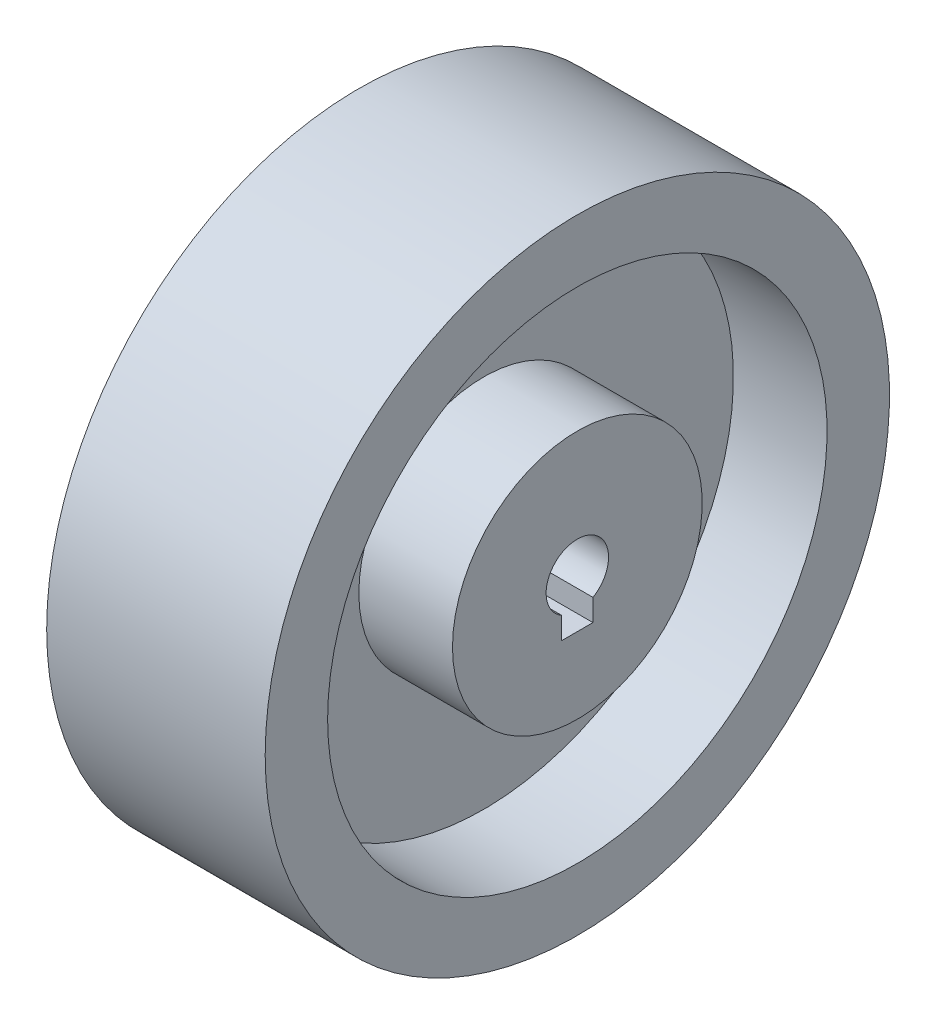
ISO-10303-21;
HEADER;
FILE_DESCRIPTION(('STEP AP214'),'2;1');
FILE_NAME('part.step','',(''),(''),'','','');
FILE_SCHEMA(('AUTOMOTIVE_DESIGN { 1 0 10303 214 1 1 1 1 }'));
ENDSEC;
DATA;
#1=APPLICATION_CONTEXT('core data for automotive mechanical design processes');
#2=APPLICATION_PROTOCOL_DEFINITION('international standard','automotive_design',2000,#1);
#3=PRODUCT_CONTEXT('',#1,'mechanical');
#4=PRODUCT('Part','Part','',(#3));
#5=PRODUCT_RELATED_PRODUCT_CATEGORY('part','',(#4));
#6=PRODUCT_DEFINITION_FORMATION('','',#4);
#7=PRODUCT_DEFINITION_CONTEXT('part definition',#1,'design');
#8=PRODUCT_DEFINITION('design','',#6,#7);
#9=PRODUCT_DEFINITION_SHAPE('','',#8);
#10=(LENGTH_UNIT() NAMED_UNIT(*) SI_UNIT(.MILLI.,.METRE.));
#11=(NAMED_UNIT(*) PLANE_ANGLE_UNIT() SI_UNIT($,.RADIAN.));
#12=(NAMED_UNIT(*) SI_UNIT($,.STERADIAN.) SOLID_ANGLE_UNIT());
#13=UNCERTAINTY_MEASURE_WITH_UNIT(LENGTH_MEASURE(1.E-05),#10,'distance_accuracy_value','');
#14=(GEOMETRIC_REPRESENTATION_CONTEXT(3) GLOBAL_UNCERTAINTY_ASSIGNED_CONTEXT((#13)) GLOBAL_UNIT_ASSIGNED_CONTEXT((#10,
#11,#12)) REPRESENTATION_CONTEXT('',''));
#15=CARTESIAN_POINT('',(0.,0.,0.));
#16=DIRECTION('',(0.,0.,1.));
#17=DIRECTION('',(1.,0.,0.));
#18=AXIS2_PLACEMENT_3D('',#15,#16,#17);
#19=CARTESIAN_POINT('',(-17.5,20.,0.));
#20=DIRECTION('',(1.,0.,0.));
#21=DIRECTION('',(0.,0.,-1.));
#22=AXIS2_PLACEMENT_3D('',#19,#20,#21);
#23=PLANE('',#22);
#24=CARTESIAN_POINT('',(-17.5,0.,0.));
#25=DIRECTION('',(-1.,0.,0.));
#26=DIRECTION('',(0.,0.,1.));
#27=AXIS2_PLACEMENT_3D('',#24,#25,#26);
#28=CIRCLE('',#27,5.);
#29=CARTESIAN_POINT('',(-17.5,-4.3301270189222,2.5));
#30=VERTEX_POINT('',#29);
#31=CARTESIAN_POINT('',(-17.5,-4.3301270189222,-2.5));
#32=VERTEX_POINT('',#31);
#33=EDGE_CURVE('E11',#30,#32,#28,.T.);
#34=ORIENTED_EDGE('',*,*,#33,.F.);
#35=DIRECTION('',(0.,-1.,0.));
#36=VECTOR('',#35,1.);
#37=CARTESIAN_POINT('',(-17.5,-4.3301270189222,2.5));
#38=LINE('',#37,#36);
#39=CARTESIAN_POINT('',(-17.5,-7.8301270189222,2.5));
#40=VERTEX_POINT('',#39);
#41=EDGE_CURVE('E56',#30,#40,#38,.T.);
#42=ORIENTED_EDGE('',*,*,#41,.T.);
#43=DIRECTION('',(0.,0.,-1.));
#44=VECTOR('',#43,1.);
#45=CARTESIAN_POINT('',(-17.5,-7.8301270189222,2.5));
#46=LINE('',#45,#44);
#47=CARTESIAN_POINT('',(-17.5,-7.8301270189222,-2.5));
#48=VERTEX_POINT('',#47);
#49=EDGE_CURVE('E87',#40,#48,#46,.T.);
#50=ORIENTED_EDGE('',*,*,#49,.T.);
#51=DIRECTION('',(0.,-1.,0.));
#52=VECTOR('',#51,1.);
#53=CARTESIAN_POINT('',(-17.5,-4.3301270189222,-2.5));
#54=LINE('',#53,#52);
#55=EDGE_CURVE('E77',#32,#48,#54,.T.);
#56=ORIENTED_EDGE('',*,*,#55,.F.);
#57=EDGE_LOOP('',(#34,#42,#50,#56));
#58=FACE_BOUND('',#57,.T.);
#59=CARTESIAN_POINT('',(-17.5,0.,0.));
#60=DIRECTION('',(-1.,0.,0.));
#61=DIRECTION('',(0.,0.,1.));
#62=AXIS2_PLACEMENT_3D('',#59,#60,#61);
#63=CIRCLE('',#62,20.);
#64=CARTESIAN_POINT('',(-17.5,0.,20.));
#65=VERTEX_POINT('',#64);
#66=EDGE_CURVE('E104',#65,#65,#63,.T.);
#67=ORIENTED_EDGE('',*,*,#66,.T.);
#68=EDGE_LOOP('',(#67));
#69=FACE_BOUND('',#68,.T.);
#70=ADVANCED_FACE('F36',(#58,#69),#23,.F.);
#71=CARTESIAN_POINT('',(-17.5,0.,0.));
#72=DIRECTION('',(-1.,0.,0.));
#73=DIRECTION('',(0.,0.,1.));
#74=AXIS2_PLACEMENT_3D('',#71,#72,#73);
#75=CYLINDRICAL_SURFACE('',#74,5.00000000000001);
#76=CARTESIAN_POINT('',(17.5,0.,0.));
#77=DIRECTION('',(-1.,0.,0.));
#78=DIRECTION('',(0.,0.,1.));
#79=AXIS2_PLACEMENT_3D('',#76,#77,#78);
#80=CIRCLE('',#79,5.00000000000001);
#81=CARTESIAN_POINT('',(17.5,-4.3301270189222,2.5));
#82=VERTEX_POINT('',#81);
#83=CARTESIAN_POINT('',(17.5,-4.3301270189222,-2.5));
#84=VERTEX_POINT('',#83);
#85=EDGE_CURVE('E43',#82,#84,#80,.T.);
#86=ORIENTED_EDGE('',*,*,#85,.F.);
#87=DIRECTION('',(1.,0.,0.));
#88=VECTOR('',#87,1.);
#89=CARTESIAN_POINT('',(-17.5,-4.3301270189222,2.5));
#90=LINE('',#89,#88);
#91=EDGE_CURVE('E70',#30,#82,#90,.T.);
#92=ORIENTED_EDGE('',*,*,#91,.F.);
#93=ORIENTED_EDGE('',*,*,#33,.T.);
#94=DIRECTION('',(1.,0.,0.));
#95=VECTOR('',#94,1.);
#96=CARTESIAN_POINT('',(-17.5,-4.3301270189222,-2.5));
#97=LINE('',#96,#95);
#98=EDGE_CURVE('E83',#32,#84,#97,.T.);
#99=ORIENTED_EDGE('',*,*,#98,.T.);
#100=EDGE_LOOP('',(#86,#92,#93,#99));
#101=FACE_BOUND('',#100,.T.);
#102=ADVANCED_FACE('F141',(#101),#75,.F.);
#103=CARTESIAN_POINT('',(17.5,5.00000000000001,0.));
#104=DIRECTION('',(-1.,0.,0.));
#105=DIRECTION('',(0.,0.,1.));
#106=AXIS2_PLACEMENT_3D('',#103,#104,#105);
#107=PLANE('',#106);
#108=DIRECTION('',(0.,0.,-1.));
#109=VECTOR('',#108,1.);
#110=CARTESIAN_POINT('',(17.5,-7.8301270189222,2.5));
#111=LINE('',#110,#109);
#112=CARTESIAN_POINT('',(17.5,-7.8301270189222,2.5));
#113=VERTEX_POINT('',#112);
#114=CARTESIAN_POINT('',(17.5,-7.8301270189222,-2.5));
#115=VERTEX_POINT('',#114);
#116=EDGE_CURVE('E92',#113,#115,#111,.T.);
#117=ORIENTED_EDGE('',*,*,#116,.F.);
#118=DIRECTION('',(0.,-1.,0.));
#119=VECTOR('',#118,1.);
#120=CARTESIAN_POINT('',(17.5,-4.3301270189222,2.5));
#121=LINE('',#120,#119);
#122=EDGE_CURVE('E50',#82,#113,#121,.T.);
#123=ORIENTED_EDGE('',*,*,#122,.F.);
#124=ORIENTED_EDGE('',*,*,#85,.T.);
#125=DIRECTION('',(0.,-1.,0.));
#126=VECTOR('',#125,1.);
#127=CARTESIAN_POINT('',(17.5,-4.3301270189222,-2.5));
#128=LINE('',#127,#126);
#129=EDGE_CURVE('E97',#84,#115,#128,.T.);
#130=ORIENTED_EDGE('',*,*,#129,.T.);
#131=EDGE_LOOP('',(#117,#123,#124,#130));
#132=FACE_BOUND('',#131,.T.);
#133=CARTESIAN_POINT('',(17.5,0.,0.));
#134=DIRECTION('',(-1.,0.,0.));
#135=DIRECTION('',(0.,0.,1.));
#136=AXIS2_PLACEMENT_3D('',#133,#134,#135);
#137=CIRCLE('',#136,20.);
#138=CARTESIAN_POINT('',(17.5,0.,20.));
#139=VERTEX_POINT('',#138);
#140=EDGE_CURVE('E133',#139,#139,#137,.T.);
#141=ORIENTED_EDGE('',*,*,#140,.F.);
#142=EDGE_LOOP('',(#141));
#143=FACE_BOUND('',#142,.T.);
#144=ADVANCED_FACE('F138',(#132,#143),#107,.F.);
#145=CARTESIAN_POINT('',(-17.5,0.,0.));
#146=DIRECTION('',(-1.,0.,0.));
#147=DIRECTION('',(0.,0.,1.));
#148=AXIS2_PLACEMENT_3D('',#145,#146,#147);
#149=CYLINDRICAL_SURFACE('',#148,20.);
#150=CARTESIAN_POINT('',(2.5,0.,0.));
#151=DIRECTION('',(-1.,0.,0.));
#152=DIRECTION('',(0.,0.,1.));
#153=AXIS2_PLACEMENT_3D('',#150,#151,#152);
#154=CIRCLE('',#153,20.);
#155=CARTESIAN_POINT('',(2.5,0.,20.));
#156=VERTEX_POINT('',#155);
#157=EDGE_CURVE('E130',#156,#156,#154,.T.);
#158=ORIENTED_EDGE('',*,*,#157,.F.);
#159=EDGE_LOOP('',(#158));
#160=FACE_BOUND('',#159,.T.);
#161=ORIENTED_EDGE('',*,*,#140,.T.);
#162=EDGE_LOOP('',(#161));
#163=FACE_BOUND('',#162,.T.);
#164=ADVANCED_FACE('F147',(#160,#163),#149,.T.);
#165=CARTESIAN_POINT('',(2.5,40.,0.));
#166=DIRECTION('',(-1.,0.,0.));
#167=DIRECTION('',(0.,0.,1.));
#168=AXIS2_PLACEMENT_3D('',#165,#166,#167);
#169=PLANE('',#168);
#170=CARTESIAN_POINT('',(2.5,0.,0.));
#171=DIRECTION('',(-1.,0.,0.));
#172=DIRECTION('',(0.,0.,1.));
#173=AXIS2_PLACEMENT_3D('',#170,#171,#172);
#174=CIRCLE('',#173,40.);
#175=CARTESIAN_POINT('',(2.5,0.,40.));
#176=VERTEX_POINT('',#175);
#177=EDGE_CURVE('E127',#176,#176,#174,.T.);
#178=ORIENTED_EDGE('',*,*,#177,.F.);
#179=EDGE_LOOP('',(#178));
#180=FACE_BOUND('',#179,.T.);
#181=ORIENTED_EDGE('',*,*,#157,.T.);
#182=EDGE_LOOP('',(#181));
#183=FACE_BOUND('',#182,.T.);
#184=ADVANCED_FACE('F152',(#180,#183),#169,.F.);
#185=CARTESIAN_POINT('',(-17.5,0.,0.));
#186=DIRECTION('',(-1.,0.,0.));
#187=DIRECTION('',(0.,0.,1.));
#188=AXIS2_PLACEMENT_3D('',#185,#186,#187);
#189=CYLINDRICAL_SURFACE('',#188,40.);
#190=CARTESIAN_POINT('',(17.5,0.,0.));
#191=DIRECTION('',(-1.,0.,0.));
#192=DIRECTION('',(0.,0.,1.));
#193=AXIS2_PLACEMENT_3D('',#190,#191,#192);
#194=CIRCLE('',#193,40.);
#195=CARTESIAN_POINT('',(17.5,0.,40.));
#196=VERTEX_POINT('',#195);
#197=EDGE_CURVE('E124',#196,#196,#194,.T.);
#198=ORIENTED_EDGE('',*,*,#197,.F.);
#199=EDGE_LOOP('',(#198));
#200=FACE_BOUND('',#199,.T.);
#201=ORIENTED_EDGE('',*,*,#177,.T.);
#202=EDGE_LOOP('',(#201));
#203=FACE_BOUND('',#202,.T.);
#204=ADVANCED_FACE('F156',(#200,#203),#189,.F.);
#205=CARTESIAN_POINT('',(17.5,40.,0.));
#206=DIRECTION('',(-1.,0.,0.));
#207=DIRECTION('',(0.,0.,1.));
#208=AXIS2_PLACEMENT_3D('',#205,#206,#207);
#209=PLANE('',#208);
#210=CARTESIAN_POINT('',(17.5,0.,0.));
#211=DIRECTION('',(-1.,0.,0.));
#212=DIRECTION('',(0.,0.,1.));
#213=AXIS2_PLACEMENT_3D('',#210,#211,#212);
#214=CIRCLE('',#213,50.);
#215=CARTESIAN_POINT('',(17.5,0.,50.));
#216=VERTEX_POINT('',#215);
#217=EDGE_CURVE('E121',#216,#216,#214,.T.);
#218=ORIENTED_EDGE('',*,*,#217,.F.);
#219=EDGE_LOOP('',(#218));
#220=FACE_BOUND('',#219,.T.);
#221=ORIENTED_EDGE('',*,*,#197,.T.);
#222=EDGE_LOOP('',(#221));
#223=FACE_BOUND('',#222,.T.);
#224=ADVANCED_FACE('F160',(#220,#223),#209,.F.);
#225=CARTESIAN_POINT('',(-17.5,0.,0.));
#226=DIRECTION('',(-1.,0.,0.));
#227=DIRECTION('',(0.,0.,1.));
#228=AXIS2_PLACEMENT_3D('',#225,#226,#227);
#229=CYLINDRICAL_SURFACE('',#228,50.);
#230=CARTESIAN_POINT('',(-17.5,0.,0.));
#231=DIRECTION('',(-1.,0.,0.));
#232=DIRECTION('',(0.,0.,1.));
#233=AXIS2_PLACEMENT_3D('',#230,#231,#232);
#234=CIRCLE('',#233,50.);
#235=CARTESIAN_POINT('',(-17.5,0.,50.));
#236=VERTEX_POINT('',#235);
#237=EDGE_CURVE('E118',#236,#236,#234,.T.);
#238=ORIENTED_EDGE('',*,*,#237,.F.);
#239=EDGE_LOOP('',(#238));
#240=FACE_BOUND('',#239,.T.);
#241=ORIENTED_EDGE('',*,*,#217,.T.);
#242=EDGE_LOOP('',(#241));
#243=FACE_BOUND('',#242,.T.);
#244=ADVANCED_FACE('F164',(#240,#243),#229,.T.);
#245=CARTESIAN_POINT('',(-17.5,50.,0.));
#246=DIRECTION('',(1.,0.,0.));
#247=DIRECTION('',(0.,0.,-1.));
#248=AXIS2_PLACEMENT_3D('',#245,#246,#247);
#249=PLANE('',#248);
#250=CARTESIAN_POINT('',(-17.5,0.,0.));
#251=DIRECTION('',(-1.,0.,0.));
#252=DIRECTION('',(0.,0.,1.));
#253=AXIS2_PLACEMENT_3D('',#250,#251,#252);
#254=CIRCLE('',#253,40.);
#255=CARTESIAN_POINT('',(-17.5,0.,40.));
#256=VERTEX_POINT('',#255);
#257=EDGE_CURVE('E115',#256,#256,#254,.T.);
#258=ORIENTED_EDGE('',*,*,#257,.F.);
#259=EDGE_LOOP('',(#258));
#260=FACE_BOUND('',#259,.T.);
#261=ORIENTED_EDGE('',*,*,#237,.T.);
#262=EDGE_LOOP('',(#261));
#263=FACE_BOUND('',#262,.T.);
#264=ADVANCED_FACE('F168',(#260,#263),#249,.F.);
#265=CARTESIAN_POINT('',(-17.5,0.,0.));
#266=DIRECTION('',(-1.,0.,0.));
#267=DIRECTION('',(0.,0.,1.));
#268=AXIS2_PLACEMENT_3D('',#265,#266,#267);
#269=CYLINDRICAL_SURFACE('',#268,40.);
#270=CARTESIAN_POINT('',(-2.50000000000001,0.,0.));
#271=DIRECTION('',(-1.,0.,0.));
#272=DIRECTION('',(0.,0.,1.));
#273=AXIS2_PLACEMENT_3D('',#270,#271,#272);
#274=CIRCLE('',#273,40.);
#275=CARTESIAN_POINT('',(-2.50000000000001,0.,40.));
#276=VERTEX_POINT('',#275);
#277=EDGE_CURVE('E112',#276,#276,#274,.T.);
#278=ORIENTED_EDGE('',*,*,#277,.F.);
#279=EDGE_LOOP('',(#278));
#280=FACE_BOUND('',#279,.T.);
#281=ORIENTED_EDGE('',*,*,#257,.T.);
#282=EDGE_LOOP('',(#281));
#283=FACE_BOUND('',#282,.T.);
#284=ADVANCED_FACE('F172',(#280,#283),#269,.F.);
#285=CARTESIAN_POINT('',(-2.5,40.,0.));
#286=DIRECTION('',(1.,0.,0.));
#287=DIRECTION('',(0.,0.,-1.));
#288=AXIS2_PLACEMENT_3D('',#285,#286,#287);
#289=PLANE('',#288);
#290=CARTESIAN_POINT('',(-2.5,0.,0.));
#291=DIRECTION('',(-1.,0.,0.));
#292=DIRECTION('',(0.,0.,1.));
#293=AXIS2_PLACEMENT_3D('',#290,#291,#292);
#294=CIRCLE('',#293,20.);
#295=CARTESIAN_POINT('',(-2.5,0.,20.));
#296=VERTEX_POINT('',#295);
#297=EDGE_CURVE('E109',#296,#296,#294,.T.);
#298=ORIENTED_EDGE('',*,*,#297,.F.);
#299=EDGE_LOOP('',(#298));
#300=FACE_BOUND('',#299,.T.);
#301=ORIENTED_EDGE('',*,*,#277,.T.);
#302=EDGE_LOOP('',(#301));
#303=FACE_BOUND('',#302,.T.);
#304=ADVANCED_FACE('F176',(#300,#303),#289,.F.);
#305=CARTESIAN_POINT('',(-17.5,0.,0.));
#306=DIRECTION('',(-1.,0.,0.));
#307=DIRECTION('',(0.,0.,1.));
#308=AXIS2_PLACEMENT_3D('',#305,#306,#307);
#309=CYLINDRICAL_SURFACE('',#308,20.);
#310=ORIENTED_EDGE('',*,*,#66,.F.);
#311=EDGE_LOOP('',(#310));
#312=FACE_BOUND('',#311,.T.);
#313=ORIENTED_EDGE('',*,*,#297,.T.);
#314=EDGE_LOOP('',(#313));
#315=FACE_BOUND('',#314,.T.);
#316=ADVANCED_FACE('F180',(#312,#315),#309,.T.);
#317=CARTESIAN_POINT('',(-17.5,-4.3301270189222,2.5));
#318=DIRECTION('',(0.,0.,1.));
#319=DIRECTION('',(1.,0.,0.));
#320=AXIS2_PLACEMENT_3D('',#317,#318,#319);
#321=PLANE('',#320);
#322=ORIENTED_EDGE('',*,*,#122,.T.);
#323=DIRECTION('',(1.,0.,0.));
#324=VECTOR('',#323,1.);
#325=CARTESIAN_POINT('',(-17.5,-7.8301270189222,2.5));
#326=LINE('',#325,#324);
#327=EDGE_CURVE('E72',#40,#113,#326,.T.);
#328=ORIENTED_EDGE('',*,*,#327,.F.);
#329=ORIENTED_EDGE('',*,*,#41,.F.);
#330=ORIENTED_EDGE('',*,*,#91,.T.);
#331=EDGE_LOOP('',(#322,#328,#329,#330));
#332=FACE_BOUND('',#331,.T.);
#333=ADVANCED_FACE('F184',(#332),#321,.F.);
#334=CARTESIAN_POINT('',(-17.5,-4.3301270189222,-2.5));
#335=DIRECTION('',(0.,0.,1.));
#336=DIRECTION('',(1.,0.,0.));
#337=AXIS2_PLACEMENT_3D('',#334,#335,#336);
#338=PLANE('',#337);
#339=ORIENTED_EDGE('',*,*,#129,.F.);
#340=ORIENTED_EDGE('',*,*,#98,.F.);
#341=ORIENTED_EDGE('',*,*,#55,.T.);
#342=DIRECTION('',(1.,0.,0.));
#343=VECTOR('',#342,1.);
#344=CARTESIAN_POINT('',(-17.5,-7.8301270189222,-2.5));
#345=LINE('',#344,#343);
#346=EDGE_CURVE('E80',#48,#115,#345,.T.);
#347=ORIENTED_EDGE('',*,*,#346,.T.);
#348=EDGE_LOOP('',(#339,#340,#341,#347));
#349=FACE_BOUND('',#348,.T.);
#350=ADVANCED_FACE('F79',(#349),#338,.T.);
#351=CARTESIAN_POINT('',(-17.5,-7.8301270189222,2.5));
#352=DIRECTION('',(0.,-1.,0.));
#353=DIRECTION('',(0.,0.,-1.));
#354=AXIS2_PLACEMENT_3D('',#351,#352,#353);
#355=PLANE('',#354);
#356=ORIENTED_EDGE('',*,*,#116,.T.);
#357=ORIENTED_EDGE('',*,*,#346,.F.);
#358=ORIENTED_EDGE('',*,*,#49,.F.);
#359=ORIENTED_EDGE('',*,*,#327,.T.);
#360=EDGE_LOOP('',(#356,#357,#358,#359));
#361=FACE_BOUND('',#360,.T.);
#362=ADVANCED_FACE('F90',(#361),#355,.F.);
#363=CLOSED_SHELL('',(#70,#102,#144,#164,#184,#204,#224,#244,#264,#284,#304,#316,#333,#350,#362));
#364=MANIFOLD_SOLID_BREP('B2',#363);
#365=ADVANCED_BREP_SHAPE_REPRESENTATION('',(#18,#364),#14);
#366=SHAPE_DEFINITION_REPRESENTATION(#9,#365);
ENDSEC;
END-ISO-10303-21;
